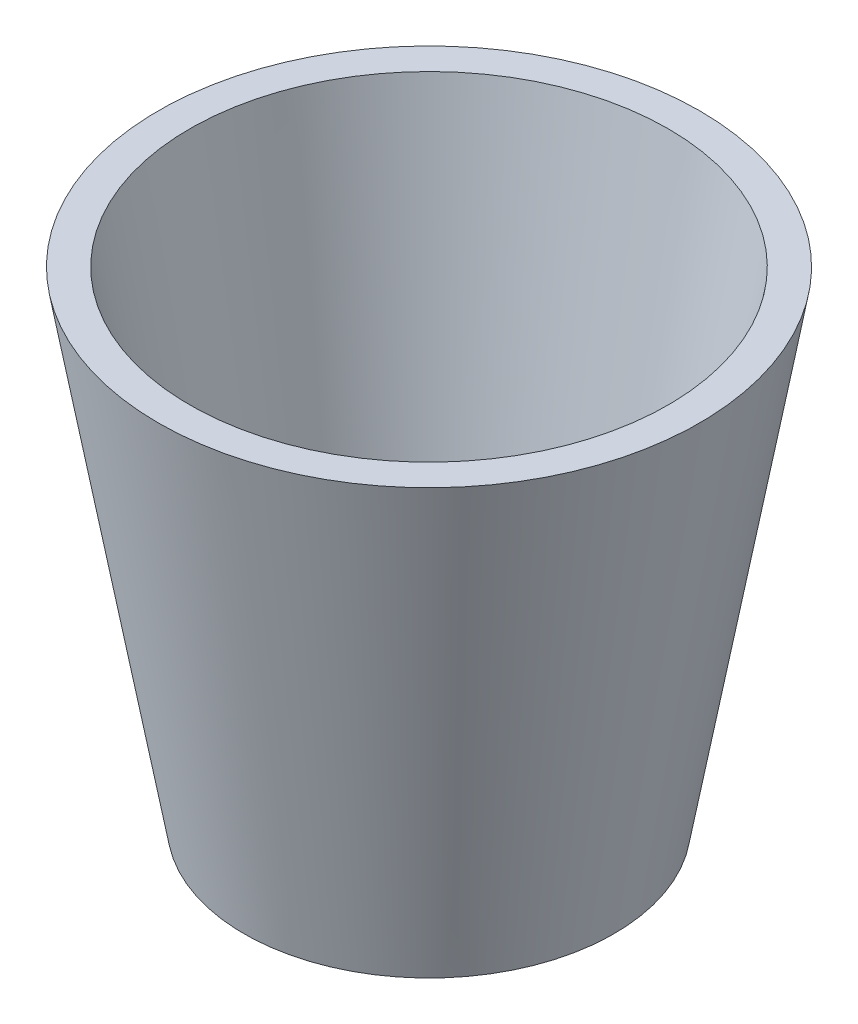
ISO-10303-21;
HEADER;
FILE_DESCRIPTION(('STEP AP214'),'2;1');
FILE_NAME('part.step','',(''),(''),'','','');
FILE_SCHEMA(('AUTOMOTIVE_DESIGN { 1 0 10303 214 1 1 1 1 }'));
ENDSEC;
DATA;
#1=APPLICATION_CONTEXT('core data for automotive mechanical design processes');
#2=APPLICATION_PROTOCOL_DEFINITION('international standard','automotive_design',2000,#1);
#3=PRODUCT_CONTEXT('',#1,'mechanical');
#4=PRODUCT('Part','Part','',(#3));
#5=PRODUCT_RELATED_PRODUCT_CATEGORY('part','',(#4));
#6=PRODUCT_DEFINITION_FORMATION('','',#4);
#7=PRODUCT_DEFINITION_CONTEXT('part definition',#1,'design');
#8=PRODUCT_DEFINITION('design','',#6,#7);
#9=PRODUCT_DEFINITION_SHAPE('','',#8);
#10=(LENGTH_UNIT() NAMED_UNIT(*) SI_UNIT(.MILLI.,.METRE.));
#11=(NAMED_UNIT(*) PLANE_ANGLE_UNIT() SI_UNIT($,.RADIAN.));
#12=(NAMED_UNIT(*) SI_UNIT($,.STERADIAN.) SOLID_ANGLE_UNIT());
#13=UNCERTAINTY_MEASURE_WITH_UNIT(LENGTH_MEASURE(1.E-05),#10,'distance_accuracy_value','');
#14=(GEOMETRIC_REPRESENTATION_CONTEXT(3) GLOBAL_UNCERTAINTY_ASSIGNED_CONTEXT((#13)) GLOBAL_UNIT_ASSIGNED_CONTEXT((#10,
#11,#12)) REPRESENTATION_CONTEXT('',''));
#15=CARTESIAN_POINT('',(0.,0.,0.));
#16=DIRECTION('',(0.,0.,1.));
#17=DIRECTION('',(1.,0.,0.));
#18=AXIS2_PLACEMENT_3D('',#15,#16,#17);
#19=CARTESIAN_POINT('',(0.,2.,0.));
#20=DIRECTION('',(0.,1.,0.));
#21=DIRECTION('',(0.,0.,1.));
#22=AXIS2_PLACEMENT_3D('',#19,#20,#21);
#23=PLANE('',#22);
#24=CARTESIAN_POINT('',(0.,2.,0.));
#25=DIRECTION('',(0.,-1.,0.));
#26=DIRECTION('',(0.,0.,-1.));
#27=AXIS2_PLACEMENT_3D('',#24,#25,#26);
#28=CIRCLE('',#27,10.3218007376454);
#29=CARTESIAN_POINT('',(0.,2.,-10.3218007376454));
#30=VERTEX_POINT('',#29);
#31=EDGE_CURVE('E10',#30,#30,#28,.T.);
#32=ORIENTED_EDGE('',*,*,#31,.F.);
#33=EDGE_LOOP('',(#32));
#34=FACE_BOUND('',#33,.T.);
#35=ADVANCED_FACE('F35',(#34),#23,.T.);
#36=CARTESIAN_POINT('',(0.,31.4683168250875,0.));
#37=DIRECTION('',(0.,1.,0.));
#38=DIRECTION('',(0.,0.,1.));
#39=AXIS2_PLACEMENT_3D('',#36,#37,#38);
#40=CONICAL_SURFACE('',#39,15.5178600699735,0.17453292519943);
#41=ORIENTED_EDGE('',*,*,#31,.T.);
#42=EDGE_LOOP('',(#41));
#43=FACE_BOUND('',#42,.T.);
#44=CARTESIAN_POINT('',(0.,31.4683168250875,0.));
#45=DIRECTION('',(0.,-1.,0.));
#46=DIRECTION('',(0.,0.,-1.));
#47=AXIS2_PLACEMENT_3D('',#44,#45,#46);
#48=CIRCLE('',#47,15.5178600699735);
#49=CARTESIAN_POINT('',(0.,31.4683168250875,-15.5178600699735));
#50=VERTEX_POINT('',#49);
#51=EDGE_CURVE('E41',#50,#50,#48,.T.);
#52=ORIENTED_EDGE('',*,*,#51,.F.);
#53=EDGE_LOOP('',(#52));
#54=FACE_BOUND('',#53,.T.);
#55=ADVANCED_FACE('F67',(#43,#54),#40,.F.);
#56=CARTESIAN_POINT('',(15.5178600699735,31.4683168250875,0.));
#57=DIRECTION('',(0.,1.,0.));
#58=DIRECTION('',(0.,0.,1.));
#59=AXIS2_PLACEMENT_3D('',#56,#57,#58);
#60=PLANE('',#59);
#61=ORIENTED_EDGE('',*,*,#51,.T.);
#62=EDGE_LOOP('',(#61));
#63=FACE_BOUND('',#62,.T.);
#64=CARTESIAN_POINT('',(0.,31.4683168250875,0.));
#65=DIRECTION('',(0.,-1.,0.));
#66=DIRECTION('',(0.,0.,-1.));
#67=AXIS2_PLACEMENT_3D('',#64,#65,#66);
#68=CIRCLE('',#67,17.548713293745);
#69=CARTESIAN_POINT('',(0.,31.4683168250875,-17.548713293745));
#70=VERTEX_POINT('',#69);
#71=EDGE_CURVE('E45',#70,#70,#68,.T.);
#72=ORIENTED_EDGE('',*,*,#71,.F.);
#73=EDGE_LOOP('',(#72));
#74=FACE_BOUND('',#73,.T.);
#75=ADVANCED_FACE('F59',(#63,#74),#60,.T.);
#76=CARTESIAN_POINT('',(0.,0.,0.));
#77=DIRECTION('',(0.,1.,0.));
#78=DIRECTION('',(0.,0.,1.));
#79=AXIS2_PLACEMENT_3D('',#76,#77,#78);
#80=CONICAL_SURFACE('',#79,12.,0.17453292519943);
#81=ORIENTED_EDGE('',*,*,#71,.T.);
#82=EDGE_LOOP('',(#81));
#83=FACE_BOUND('',#82,.T.);
#84=CARTESIAN_POINT('',(0.,0.,0.));
#85=DIRECTION('',(0.,-1.,0.));
#86=DIRECTION('',(0.,0.,-1.));
#87=AXIS2_PLACEMENT_3D('',#84,#85,#86);
#88=CIRCLE('',#87,12.);
#89=CARTESIAN_POINT('',(0.,0.,-12.));
#90=VERTEX_POINT('',#89);
#91=EDGE_CURVE('E49',#90,#90,#88,.T.);
#92=ORIENTED_EDGE('',*,*,#91,.F.);
#93=EDGE_LOOP('',(#92));
#94=FACE_BOUND('',#93,.T.);
#95=ADVANCED_FACE('F57',(#83,#94),#80,.T.);
#96=CARTESIAN_POINT('',(0.,0.,0.));
#97=DIRECTION('',(0.,-1.,0.));
#98=DIRECTION('',(0.,0.,-1.));
#99=AXIS2_PLACEMENT_3D('',#96,#97,#98);
#100=PLANE('',#99);
#101=ORIENTED_EDGE('',*,*,#91,.T.);
#102=EDGE_LOOP('',(#101));
#103=FACE_BOUND('',#102,.T.);
#104=ADVANCED_FACE('F55',(#103),#100,.T.);
#105=CLOSED_SHELL('',(#35,#55,#75,#95,#104));
#106=MANIFOLD_SOLID_BREP('B2',#105);
#107=ADVANCED_BREP_SHAPE_REPRESENTATION('',(#18,#106),#14);
#108=SHAPE_DEFINITION_REPRESENTATION(#9,#107);
ENDSEC;
END-ISO-10303-21;
